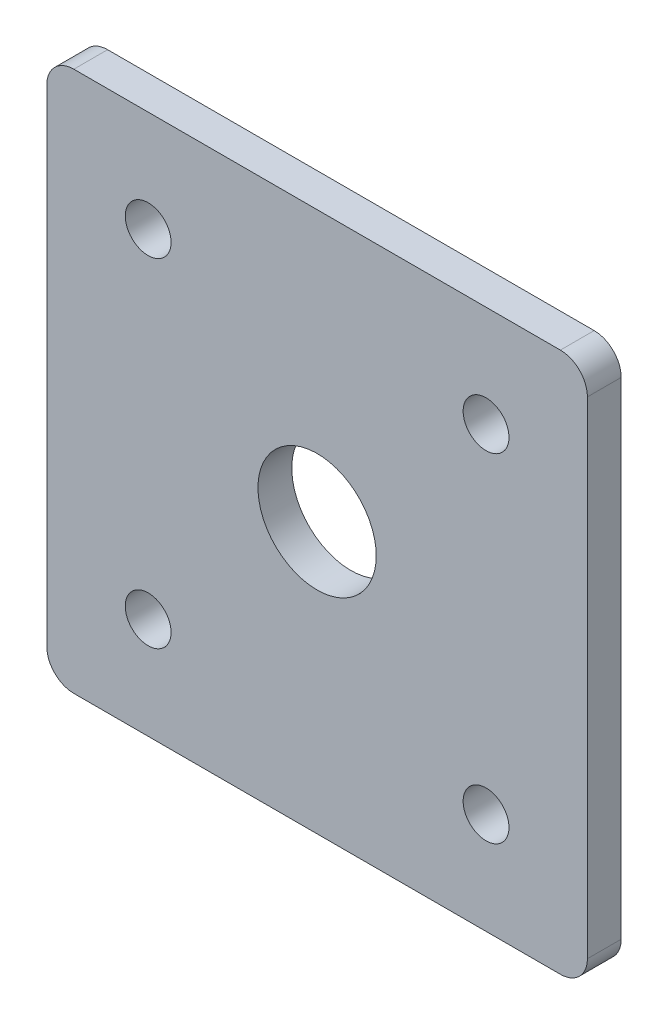
ISO-10303-21;
HEADER;
FILE_DESCRIPTION(('STEP AP214'),'2;1');
FILE_NAME('part.step','',(''),(''),'','','');
FILE_SCHEMA(('AUTOMOTIVE_DESIGN { 1 0 10303 214 1 1 1 1 }'));
ENDSEC;
DATA;
#1=APPLICATION_CONTEXT('core data for automotive mechanical design processes');
#2=APPLICATION_PROTOCOL_DEFINITION('international standard','automotive_design',2000,#1);
#3=PRODUCT_CONTEXT('',#1,'mechanical');
#4=PRODUCT('Part','Part','',(#3));
#5=PRODUCT_RELATED_PRODUCT_CATEGORY('part','',(#4));
#6=PRODUCT_DEFINITION_FORMATION('','',#4);
#7=PRODUCT_DEFINITION_CONTEXT('part definition',#1,'design');
#8=PRODUCT_DEFINITION('design','',#6,#7);
#9=PRODUCT_DEFINITION_SHAPE('','',#8);
#10=(LENGTH_UNIT() NAMED_UNIT(*) SI_UNIT(.MILLI.,.METRE.));
#11=(NAMED_UNIT(*) PLANE_ANGLE_UNIT() SI_UNIT($,.RADIAN.));
#12=(NAMED_UNIT(*) SI_UNIT($,.STERADIAN.) SOLID_ANGLE_UNIT());
#13=UNCERTAINTY_MEASURE_WITH_UNIT(LENGTH_MEASURE(1.E-05),#10,'distance_accuracy_value','');
#14=(GEOMETRIC_REPRESENTATION_CONTEXT(3) GLOBAL_UNCERTAINTY_ASSIGNED_CONTEXT((#13)) GLOBAL_UNIT_ASSIGNED_CONTEXT((#10,
#11,#12)) REPRESENTATION_CONTEXT('',''));
#15=CARTESIAN_POINT('',(0.,0.,0.));
#16=DIRECTION('',(0.,0.,1.));
#17=DIRECTION('',(1.,0.,0.));
#18=AXIS2_PLACEMENT_3D('',#15,#16,#17);
#19=CARTESIAN_POINT('',(25.4,-25.4,-1.5875));
#20=DIRECTION('',(1.,0.,0.));
#21=DIRECTION('',(0.,0.,-1.));
#22=AXIS2_PLACEMENT_3D('',#19,#20,#21);
#23=PLANE('',#22);
#24=DIRECTION('',(0.,1.,0.));
#25=VECTOR('',#24,1.);
#26=CARTESIAN_POINT('',(25.4,-25.4,1.5875));
#27=LINE('',#26,#25);
#28=CARTESIAN_POINT('',(25.4,-22.86,1.5875));
#29=VERTEX_POINT('',#28);
#30=CARTESIAN_POINT('',(25.4,22.86,1.5875));
#31=VERTEX_POINT('',#30);
#32=EDGE_CURVE('E169',#29,#31,#27,.T.);
#33=ORIENTED_EDGE('',*,*,#32,.F.);
#34=DIRECTION('',(0.,0.,1.));
#35=VECTOR('',#34,1.);
#36=CARTESIAN_POINT('',(25.4,-22.86,-1.5875));
#37=LINE('',#36,#35);
#38=CARTESIAN_POINT('',(25.4,-22.86,-1.5875));
#39=VERTEX_POINT('',#38);
#40=EDGE_CURVE('E158',#29,#39,#37,.F.);
#41=ORIENTED_EDGE('',*,*,#40,.T.);
#42=DIRECTION('',(0.,1.,0.));
#43=VECTOR('',#42,1.);
#44=CARTESIAN_POINT('',(25.4,-25.4,-1.5875));
#45=LINE('',#44,#43);
#46=CARTESIAN_POINT('',(25.4,22.86,-1.5875));
#47=VERTEX_POINT('',#46);
#48=EDGE_CURVE('E162',#39,#47,#45,.T.);
#49=ORIENTED_EDGE('',*,*,#48,.T.);
#50=DIRECTION('',(0.,0.,1.));
#51=VECTOR('',#50,1.);
#52=CARTESIAN_POINT('',(25.4,22.86,-1.5875));
#53=LINE('',#52,#51);
#54=EDGE_CURVE('E155',#47,#31,#53,.T.);
#55=ORIENTED_EDGE('',*,*,#54,.T.);
#56=EDGE_LOOP('',(#33,#41,#49,#55));
#57=FACE_BOUND('',#56,.T.);
#58=ADVANCED_FACE('F39',(#57),#23,.T.);
#59=CARTESIAN_POINT('',(-25.4,-25.4,-1.5875));
#60=DIRECTION('',(0.,-1.,0.));
#61=DIRECTION('',(0.,0.,-1.));
#62=AXIS2_PLACEMENT_3D('',#59,#60,#61);
#63=PLANE('',#62);
#64=DIRECTION('',(1.,0.,0.));
#65=VECTOR('',#64,1.);
#66=CARTESIAN_POINT('',(-25.4,-25.4,1.5875));
#67=LINE('',#66,#65);
#68=CARTESIAN_POINT('',(-22.86,-25.4,1.5875));
#69=VERTEX_POINT('',#68);
#70=CARTESIAN_POINT('',(22.86,-25.4,1.5875));
#71=VERTEX_POINT('',#70);
#72=EDGE_CURVE('E124',#69,#71,#67,.T.);
#73=ORIENTED_EDGE('',*,*,#72,.F.);
#74=DIRECTION('',(0.,0.,1.));
#75=VECTOR('',#74,1.);
#76=CARTESIAN_POINT('',(-22.86,-25.4,-1.5875));
#77=LINE('',#76,#75);
#78=CARTESIAN_POINT('',(-22.86,-25.4,-1.5875));
#79=VERTEX_POINT('',#78);
#80=EDGE_CURVE('E146',#69,#79,#77,.F.);
#81=ORIENTED_EDGE('',*,*,#80,.T.);
#82=DIRECTION('',(1.,0.,0.));
#83=VECTOR('',#82,1.);
#84=CARTESIAN_POINT('',(-25.4,-25.4,-1.5875));
#85=LINE('',#84,#83);
#86=CARTESIAN_POINT('',(22.86,-25.4,-1.5875));
#87=VERTEX_POINT('',#86);
#88=EDGE_CURVE('E126',#79,#87,#85,.T.);
#89=ORIENTED_EDGE('',*,*,#88,.T.);
#90=DIRECTION('',(0.,0.,1.));
#91=VECTOR('',#90,1.);
#92=CARTESIAN_POINT('',(22.86,-25.4,-1.5875));
#93=LINE('',#92,#91);
#94=EDGE_CURVE('E143',#87,#71,#93,.T.);
#95=ORIENTED_EDGE('',*,*,#94,.T.);
#96=EDGE_LOOP('',(#73,#81,#89,#95));
#97=FACE_BOUND('',#96,.T.);
#98=ADVANCED_FACE('F250',(#97),#63,.T.);
#99=CARTESIAN_POINT('',(-25.4,-25.4,-1.5875));
#100=DIRECTION('',(-1.,0.,0.));
#101=DIRECTION('',(0.,0.,1.));
#102=AXIS2_PLACEMENT_3D('',#99,#100,#101);
#103=PLANE('',#102);
#104=DIRECTION('',(0.,-1.,0.));
#105=VECTOR('',#104,1.);
#106=CARTESIAN_POINT('',(-25.4,-25.4,-1.5875));
#107=LINE('',#106,#105);
#108=CARTESIAN_POINT('',(-25.4,22.86,-1.5875));
#109=VERTEX_POINT('',#108);
#110=CARTESIAN_POINT('',(-25.4,-22.86,-1.5875));
#111=VERTEX_POINT('',#110);
#112=EDGE_CURVE('E130',#109,#111,#107,.T.);
#113=ORIENTED_EDGE('',*,*,#112,.T.);
#114=DIRECTION('',(0.,0.,1.));
#115=VECTOR('',#114,1.);
#116=CARTESIAN_POINT('',(-25.4,-22.86,-1.5875));
#117=LINE('',#116,#115);
#118=CARTESIAN_POINT('',(-25.4,-22.86,1.5875));
#119=VERTEX_POINT('',#118);
#120=EDGE_CURVE('E115',#111,#119,#117,.T.);
#121=ORIENTED_EDGE('',*,*,#120,.T.);
#122=DIRECTION('',(0.,-1.,0.));
#123=VECTOR('',#122,1.);
#124=CARTESIAN_POINT('',(-25.4,-25.4,1.5875));
#125=LINE('',#124,#123);
#126=CARTESIAN_POINT('',(-25.4,22.86,1.5875));
#127=VERTEX_POINT('',#126);
#128=EDGE_CURVE('E107',#127,#119,#125,.T.);
#129=ORIENTED_EDGE('',*,*,#128,.F.);
#130=DIRECTION('',(0.,0.,1.));
#131=VECTOR('',#130,1.);
#132=CARTESIAN_POINT('',(-25.4,22.86,-1.5875));
#133=LINE('',#132,#131);
#134=EDGE_CURVE('E121',#127,#109,#133,.F.);
#135=ORIENTED_EDGE('',*,*,#134,.T.);
#136=EDGE_LOOP('',(#113,#121,#129,#135));
#137=FACE_BOUND('',#136,.T.);
#138=ADVANCED_FACE('F120',(#137),#103,.T.);
#139=CARTESIAN_POINT('',(-25.4,25.4,-1.5875));
#140=DIRECTION('',(0.,1.,0.));
#141=DIRECTION('',(0.,0.,1.));
#142=AXIS2_PLACEMENT_3D('',#139,#140,#141);
#143=PLANE('',#142);
#144=DIRECTION('',(-1.,0.,0.));
#145=VECTOR('',#144,1.);
#146=CARTESIAN_POINT('',(-25.4,25.4,1.5875));
#147=LINE('',#146,#145);
#148=CARTESIAN_POINT('',(22.86,25.4,1.5875));
#149=VERTEX_POINT('',#148);
#150=CARTESIAN_POINT('',(-22.86,25.4,1.5875));
#151=VERTEX_POINT('',#150);
#152=EDGE_CURVE('E108',#149,#151,#147,.T.);
#153=ORIENTED_EDGE('',*,*,#152,.F.);
#154=DIRECTION('',(0.,0.,1.));
#155=VECTOR('',#154,1.);
#156=CARTESIAN_POINT('',(22.86,25.4,-1.5875));
#157=LINE('',#156,#155);
#158=CARTESIAN_POINT('',(22.86,25.4,-1.5875));
#159=VERTEX_POINT('',#158);
#160=EDGE_CURVE('E12',#149,#159,#157,.F.);
#161=ORIENTED_EDGE('',*,*,#160,.T.);
#162=DIRECTION('',(-1.,0.,0.));
#163=VECTOR('',#162,1.);
#164=CARTESIAN_POINT('',(-25.4,25.4,-1.5875));
#165=LINE('',#164,#163);
#166=CARTESIAN_POINT('',(-22.86,25.4,-1.5875));
#167=VERTEX_POINT('',#166);
#168=EDGE_CURVE('E160',#159,#167,#165,.T.);
#169=ORIENTED_EDGE('',*,*,#168,.T.);
#170=DIRECTION('',(0.,0.,1.));
#171=VECTOR('',#170,1.);
#172=CARTESIAN_POINT('',(-22.86,25.4,-1.5875));
#173=LINE('',#172,#171);
#174=EDGE_CURVE('E47',#167,#151,#173,.T.);
#175=ORIENTED_EDGE('',*,*,#174,.T.);
#176=EDGE_LOOP('',(#153,#161,#169,#175));
#177=FACE_BOUND('',#176,.T.);
#178=ADVANCED_FACE('F159',(#177),#143,.T.);
#179=CARTESIAN_POINT('',(0.,0.,-1.5875));
#180=DIRECTION('',(0.,0.,-1.));
#181=DIRECTION('',(-1.,0.,0.));
#182=AXIS2_PLACEMENT_3D('',#179,#180,#181);
#183=PLANE('',#182);
#184=CARTESIAN_POINT('',(-15.875,15.875,-1.5875));
#185=DIRECTION('',(0.,0.,1.));
#186=DIRECTION('',(1.,0.,0.));
#187=AXIS2_PLACEMENT_3D('',#184,#185,#186);
#188=CIRCLE('',#187,2.15265);
#189=CARTESIAN_POINT('',(-13.72235,15.875,-1.5875));
#190=VERTEX_POINT('',#189);
#191=EDGE_CURVE('E214',#190,#190,#188,.T.);
#192=ORIENTED_EDGE('',*,*,#191,.T.);
#193=EDGE_LOOP('',(#192));
#194=FACE_BOUND('',#193,.T.);
#195=CARTESIAN_POINT('',(15.875,15.875,-1.5875));
#196=DIRECTION('',(0.,0.,1.));
#197=DIRECTION('',(1.,0.,0.));
#198=AXIS2_PLACEMENT_3D('',#195,#196,#197);
#199=CIRCLE('',#198,2.15265);
#200=CARTESIAN_POINT('',(18.02765,15.875,-1.5875));
#201=VERTEX_POINT('',#200);
#202=EDGE_CURVE('E204',#201,#201,#199,.T.);
#203=ORIENTED_EDGE('',*,*,#202,.T.);
#204=EDGE_LOOP('',(#203));
#205=FACE_BOUND('',#204,.T.);
#206=CARTESIAN_POINT('',(15.875,-15.875,-1.5875));
#207=DIRECTION('',(0.,0.,1.));
#208=DIRECTION('',(1.,0.,0.));
#209=AXIS2_PLACEMENT_3D('',#206,#207,#208);
#210=CIRCLE('',#209,2.15265);
#211=CARTESIAN_POINT('',(18.02765,-15.875,-1.5875));
#212=VERTEX_POINT('',#211);
#213=EDGE_CURVE('E196',#212,#212,#210,.T.);
#214=ORIENTED_EDGE('',*,*,#213,.T.);
#215=EDGE_LOOP('',(#214));
#216=FACE_BOUND('',#215,.T.);
#217=CARTESIAN_POINT('',(-15.875,-15.875,-1.5875));
#218=DIRECTION('',(0.,0.,1.));
#219=DIRECTION('',(1.,0.,0.));
#220=AXIS2_PLACEMENT_3D('',#217,#218,#219);
#221=CIRCLE('',#220,2.15265);
#222=CARTESIAN_POINT('',(-13.72235,-15.875,-1.5875));
#223=VERTEX_POINT('',#222);
#224=EDGE_CURVE('E187',#223,#223,#221,.T.);
#225=ORIENTED_EDGE('',*,*,#224,.T.);
#226=EDGE_LOOP('',(#225));
#227=FACE_BOUND('',#226,.T.);
#228=CARTESIAN_POINT('',(0.,0.,-1.5875));
#229=DIRECTION('',(0.,0.,1.));
#230=DIRECTION('',(1.,0.,0.));
#231=AXIS2_PLACEMENT_3D('',#228,#229,#230);
#232=CIRCLE('',#231,5.55625);
#233=CARTESIAN_POINT('',(5.55624999999998,0.,-1.5875));
#234=VERTEX_POINT('',#233);
#235=EDGE_CURVE('E173',#234,#234,#232,.T.);
#236=ORIENTED_EDGE('',*,*,#235,.T.);
#237=EDGE_LOOP('',(#236));
#238=FACE_BOUND('',#237,.T.);
#239=ORIENTED_EDGE('',*,*,#88,.F.);
#240=CARTESIAN_POINT('',(-22.86,-22.86,-1.5875));
#241=DIRECTION('',(0.,0.,-1.));
#242=DIRECTION('',(-1.,0.,0.));
#243=AXIS2_PLACEMENT_3D('',#240,#241,#242);
#244=CIRCLE('',#243,2.54);
#245=EDGE_CURVE('E153',#79,#111,#244,.T.);
#246=ORIENTED_EDGE('',*,*,#245,.T.);
#247=ORIENTED_EDGE('',*,*,#112,.F.);
#248=CARTESIAN_POINT('',(-22.86,22.86,-1.5875));
#249=DIRECTION('',(0.,0.,-1.));
#250=DIRECTION('',(-1.,0.,0.));
#251=AXIS2_PLACEMENT_3D('',#248,#249,#250);
#252=CIRCLE('',#251,2.54);
#253=EDGE_CURVE('E54',#109,#167,#252,.T.);
#254=ORIENTED_EDGE('',*,*,#253,.T.);
#255=ORIENTED_EDGE('',*,*,#168,.F.);
#256=CARTESIAN_POINT('',(22.86,22.86,-1.5875));
#257=DIRECTION('',(0.,0.,-1.));
#258=DIRECTION('',(-1.,0.,0.));
#259=AXIS2_PLACEMENT_3D('',#256,#257,#258);
#260=CIRCLE('',#259,2.54);
#261=EDGE_CURVE('E149',#159,#47,#260,.T.);
#262=ORIENTED_EDGE('',*,*,#261,.T.);
#263=ORIENTED_EDGE('',*,*,#48,.F.);
#264=CARTESIAN_POINT('',(22.86,-22.86,-1.5875));
#265=DIRECTION('',(0.,0.,-1.));
#266=DIRECTION('',(-1.,0.,0.));
#267=AXIS2_PLACEMENT_3D('',#264,#265,#266);
#268=CIRCLE('',#267,2.54);
#269=EDGE_CURVE('E151',#39,#87,#268,.T.);
#270=ORIENTED_EDGE('',*,*,#269,.T.);
#271=EDGE_LOOP('',(#239,#246,#247,#254,#255,#262,#263,#270));
#272=FACE_BOUND('',#271,.T.);
#273=ADVANCED_FACE('F227',(#194,#205,#216,#227,#238,#272),#183,.T.);
#274=CARTESIAN_POINT('',(0.,0.,1.5875));
#275=DIRECTION('',(0.,0.,-1.));
#276=DIRECTION('',(-1.,0.,0.));
#277=AXIS2_PLACEMENT_3D('',#274,#275,#276);
#278=PLANE('',#277);
#279=CARTESIAN_POINT('',(-15.875,15.875,1.5875));
#280=DIRECTION('',(0.,0.,1.));
#281=DIRECTION('',(1.,0.,0.));
#282=AXIS2_PLACEMENT_3D('',#279,#280,#281);
#283=CIRCLE('',#282,2.15265);
#284=CARTESIAN_POINT('',(-13.72235,15.875,1.5875));
#285=VERTEX_POINT('',#284);
#286=EDGE_CURVE('E216',#285,#285,#283,.T.);
#287=ORIENTED_EDGE('',*,*,#286,.F.);
#288=EDGE_LOOP('',(#287));
#289=FACE_BOUND('',#288,.T.);
#290=CARTESIAN_POINT('',(15.875,15.875,1.5875));
#291=DIRECTION('',(0.,0.,1.));
#292=DIRECTION('',(1.,0.,0.));
#293=AXIS2_PLACEMENT_3D('',#290,#291,#292);
#294=CIRCLE('',#293,2.15265);
#295=CARTESIAN_POINT('',(18.02765,15.875,1.5875));
#296=VERTEX_POINT('',#295);
#297=EDGE_CURVE('E209',#296,#296,#294,.T.);
#298=ORIENTED_EDGE('',*,*,#297,.F.);
#299=EDGE_LOOP('',(#298));
#300=FACE_BOUND('',#299,.T.);
#301=CARTESIAN_POINT('',(15.875,-15.875,1.5875));
#302=DIRECTION('',(0.,0.,1.));
#303=DIRECTION('',(1.,0.,0.));
#304=AXIS2_PLACEMENT_3D('',#301,#302,#303);
#305=CIRCLE('',#304,2.15265);
#306=CARTESIAN_POINT('',(18.02765,-15.875,1.5875));
#307=VERTEX_POINT('',#306);
#308=EDGE_CURVE('E199',#307,#307,#305,.T.);
#309=ORIENTED_EDGE('',*,*,#308,.F.);
#310=EDGE_LOOP('',(#309));
#311=FACE_BOUND('',#310,.T.);
#312=CARTESIAN_POINT('',(-15.875,-15.875,1.5875));
#313=DIRECTION('',(0.,0.,1.));
#314=DIRECTION('',(1.,0.,0.));
#315=AXIS2_PLACEMENT_3D('',#312,#313,#314);
#316=CIRCLE('',#315,2.15265);
#317=CARTESIAN_POINT('',(-13.72235,-15.875,1.5875));
#318=VERTEX_POINT('',#317);
#319=EDGE_CURVE('E191',#318,#318,#316,.T.);
#320=ORIENTED_EDGE('',*,*,#319,.F.);
#321=EDGE_LOOP('',(#320));
#322=FACE_BOUND('',#321,.T.);
#323=CARTESIAN_POINT('',(0.,0.,1.5875));
#324=DIRECTION('',(0.,0.,1.));
#325=DIRECTION('',(1.,0.,0.));
#326=AXIS2_PLACEMENT_3D('',#323,#324,#325);
#327=CIRCLE('',#326,5.55625);
#328=CARTESIAN_POINT('',(5.55624999999998,0.,1.5875));
#329=VERTEX_POINT('',#328);
#330=EDGE_CURVE('E182',#329,#329,#327,.T.);
#331=ORIENTED_EDGE('',*,*,#330,.F.);
#332=EDGE_LOOP('',(#331));
#333=FACE_BOUND('',#332,.T.);
#334=ORIENTED_EDGE('',*,*,#128,.T.);
#335=CARTESIAN_POINT('',(-22.86,-22.86,1.5875));
#336=DIRECTION('',(0.,0.,-1.));
#337=DIRECTION('',(-1.,0.,0.));
#338=AXIS2_PLACEMENT_3D('',#335,#336,#337);
#339=CIRCLE('',#338,2.54);
#340=EDGE_CURVE('E140',#119,#69,#339,.F.);
#341=ORIENTED_EDGE('',*,*,#340,.T.);
#342=ORIENTED_EDGE('',*,*,#72,.T.);
#343=CARTESIAN_POINT('',(22.86,-22.86,1.5875));
#344=DIRECTION('',(0.,0.,-1.));
#345=DIRECTION('',(-1.,0.,0.));
#346=AXIS2_PLACEMENT_3D('',#343,#344,#345);
#347=CIRCLE('',#346,2.54);
#348=EDGE_CURVE('E137',#71,#29,#347,.F.);
#349=ORIENTED_EDGE('',*,*,#348,.T.);
#350=ORIENTED_EDGE('',*,*,#32,.T.);
#351=CARTESIAN_POINT('',(22.86,22.86,1.5875));
#352=DIRECTION('',(0.,0.,-1.));
#353=DIRECTION('',(-1.,0.,0.));
#354=AXIS2_PLACEMENT_3D('',#351,#352,#353);
#355=CIRCLE('',#354,2.54);
#356=EDGE_CURVE('E114',#31,#149,#355,.F.);
#357=ORIENTED_EDGE('',*,*,#356,.T.);
#358=ORIENTED_EDGE('',*,*,#152,.T.);
#359=CARTESIAN_POINT('',(-22.86,22.86,1.5875));
#360=DIRECTION('',(0.,0.,-1.));
#361=DIRECTION('',(-1.,0.,0.));
#362=AXIS2_PLACEMENT_3D('',#359,#360,#361);
#363=CIRCLE('',#362,2.54);
#364=EDGE_CURVE('E104',#151,#127,#363,.F.);
#365=ORIENTED_EDGE('',*,*,#364,.T.);
#366=EDGE_LOOP('',(#334,#341,#342,#349,#350,#357,#358,#365));
#367=FACE_BOUND('',#366,.T.);
#368=ADVANCED_FACE('F106',(#289,#300,#311,#322,#333,#367),#278,.F.);
#369=CARTESIAN_POINT('',(0.,0.,-1.5875));
#370=DIRECTION('',(0.,0.,1.));
#371=DIRECTION('',(1.,0.,0.));
#372=AXIS2_PLACEMENT_3D('',#369,#370,#371);
#373=CYLINDRICAL_SURFACE('',#372,5.55625);
#374=ORIENTED_EDGE('',*,*,#235,.F.);
#375=EDGE_LOOP('',(#374));
#376=FACE_BOUND('',#375,.T.);
#377=ORIENTED_EDGE('',*,*,#330,.T.);
#378=EDGE_LOOP('',(#377));
#379=FACE_BOUND('',#378,.T.);
#380=ADVANCED_FACE('F226',(#376,#379),#373,.F.);
#381=CARTESIAN_POINT('',(-15.875,-15.875,1.5875));
#382=DIRECTION('',(0.,0.,1.));
#383=DIRECTION('',(1.,0.,0.));
#384=AXIS2_PLACEMENT_3D('',#381,#382,#383);
#385=CYLINDRICAL_SURFACE('',#384,2.15265);
#386=ORIENTED_EDGE('',*,*,#224,.F.);
#387=EDGE_LOOP('',(#386));
#388=FACE_BOUND('',#387,.T.);
#389=ORIENTED_EDGE('',*,*,#319,.T.);
#390=EDGE_LOOP('',(#389));
#391=FACE_BOUND('',#390,.T.);
#392=ADVANCED_FACE('F238',(#388,#391),#385,.F.);
#393=CARTESIAN_POINT('',(15.875,-15.875,1.5875));
#394=DIRECTION('',(0.,0.,1.));
#395=DIRECTION('',(1.,0.,0.));
#396=AXIS2_PLACEMENT_3D('',#393,#394,#395);
#397=CYLINDRICAL_SURFACE('',#396,2.15265);
#398=ORIENTED_EDGE('',*,*,#213,.F.);
#399=EDGE_LOOP('',(#398));
#400=FACE_BOUND('',#399,.T.);
#401=ORIENTED_EDGE('',*,*,#308,.T.);
#402=EDGE_LOOP('',(#401));
#403=FACE_BOUND('',#402,.T.);
#404=ADVANCED_FACE('F244',(#400,#403),#397,.F.);
#405=CARTESIAN_POINT('',(15.875,15.875,1.5875));
#406=DIRECTION('',(0.,0.,1.));
#407=DIRECTION('',(1.,0.,0.));
#408=AXIS2_PLACEMENT_3D('',#405,#406,#407);
#409=CYLINDRICAL_SURFACE('',#408,2.15265);
#410=ORIENTED_EDGE('',*,*,#202,.F.);
#411=EDGE_LOOP('',(#410));
#412=FACE_BOUND('',#411,.T.);
#413=ORIENTED_EDGE('',*,*,#297,.T.);
#414=EDGE_LOOP('',(#413));
#415=FACE_BOUND('',#414,.T.);
#416=ADVANCED_FACE('F344',(#412,#415),#409,.F.);
#417=CARTESIAN_POINT('',(-15.875,15.875,1.5875));
#418=DIRECTION('',(0.,0.,1.));
#419=DIRECTION('',(1.,0.,0.));
#420=AXIS2_PLACEMENT_3D('',#417,#418,#419);
#421=CYLINDRICAL_SURFACE('',#420,2.15265);
#422=ORIENTED_EDGE('',*,*,#191,.F.);
#423=EDGE_LOOP('',(#422));
#424=FACE_BOUND('',#423,.T.);
#425=ORIENTED_EDGE('',*,*,#286,.T.);
#426=EDGE_LOOP('',(#425));
#427=FACE_BOUND('',#426,.T.);
#428=ADVANCED_FACE('F222',(#424,#427),#421,.F.);
#429=CARTESIAN_POINT('',(-22.86,-22.86,-1.5875));
#430=DIRECTION('',(0.,0.,1.));
#431=DIRECTION('',(1.,0.,0.));
#432=AXIS2_PLACEMENT_3D('',#429,#430,#431);
#433=CYLINDRICAL_SURFACE('',#432,2.54);
#434=ORIENTED_EDGE('',*,*,#245,.F.);
#435=ORIENTED_EDGE('',*,*,#80,.F.);
#436=ORIENTED_EDGE('',*,*,#340,.F.);
#437=ORIENTED_EDGE('',*,*,#120,.F.);
#438=EDGE_LOOP('',(#434,#435,#436,#437));
#439=FACE_BOUND('',#438,.T.);
#440=ADVANCED_FACE('F262',(#439),#433,.T.);
#441=CARTESIAN_POINT('',(22.86,-22.86,-1.5875));
#442=DIRECTION('',(0.,0.,1.));
#443=DIRECTION('',(1.,0.,0.));
#444=AXIS2_PLACEMENT_3D('',#441,#442,#443);
#445=CYLINDRICAL_SURFACE('',#444,2.54);
#446=ORIENTED_EDGE('',*,*,#269,.F.);
#447=ORIENTED_EDGE('',*,*,#40,.F.);
#448=ORIENTED_EDGE('',*,*,#348,.F.);
#449=ORIENTED_EDGE('',*,*,#94,.F.);
#450=EDGE_LOOP('',(#446,#447,#448,#449));
#451=FACE_BOUND('',#450,.T.);
#452=ADVANCED_FACE('F265',(#451),#445,.T.);
#453=CARTESIAN_POINT('',(22.86,22.86,-1.5875));
#454=DIRECTION('',(0.,0.,1.));
#455=DIRECTION('',(1.,0.,0.));
#456=AXIS2_PLACEMENT_3D('',#453,#454,#455);
#457=CYLINDRICAL_SURFACE('',#456,2.54);
#458=ORIENTED_EDGE('',*,*,#261,.F.);
#459=ORIENTED_EDGE('',*,*,#160,.F.);
#460=ORIENTED_EDGE('',*,*,#356,.F.);
#461=ORIENTED_EDGE('',*,*,#54,.F.);
#462=EDGE_LOOP('',(#458,#459,#460,#461));
#463=FACE_BOUND('',#462,.T.);
#464=ADVANCED_FACE('F268',(#463),#457,.T.);
#465=CARTESIAN_POINT('',(-22.86,22.86,-1.5875));
#466=DIRECTION('',(0.,0.,1.));
#467=DIRECTION('',(1.,0.,0.));
#468=AXIS2_PLACEMENT_3D('',#465,#466,#467);
#469=CYLINDRICAL_SURFACE('',#468,2.54);
#470=ORIENTED_EDGE('',*,*,#253,.F.);
#471=ORIENTED_EDGE('',*,*,#134,.F.);
#472=ORIENTED_EDGE('',*,*,#364,.F.);
#473=ORIENTED_EDGE('',*,*,#174,.F.);
#474=EDGE_LOOP('',(#470,#471,#472,#473));
#475=FACE_BOUND('',#474,.T.);
#476=ADVANCED_FACE('F41',(#475),#469,.T.);
#477=CLOSED_SHELL('',(#58,#98,#138,#178,#273,#368,#380,#392,#404,#416,#428,#440,#452,#464,#476));
#478=MANIFOLD_SOLID_BREP('B2',#477);
#479=ADVANCED_BREP_SHAPE_REPRESENTATION('',(#18,#478),#14);
#480=SHAPE_DEFINITION_REPRESENTATION(#9,#479);
ENDSEC;
END-ISO-10303-21;
